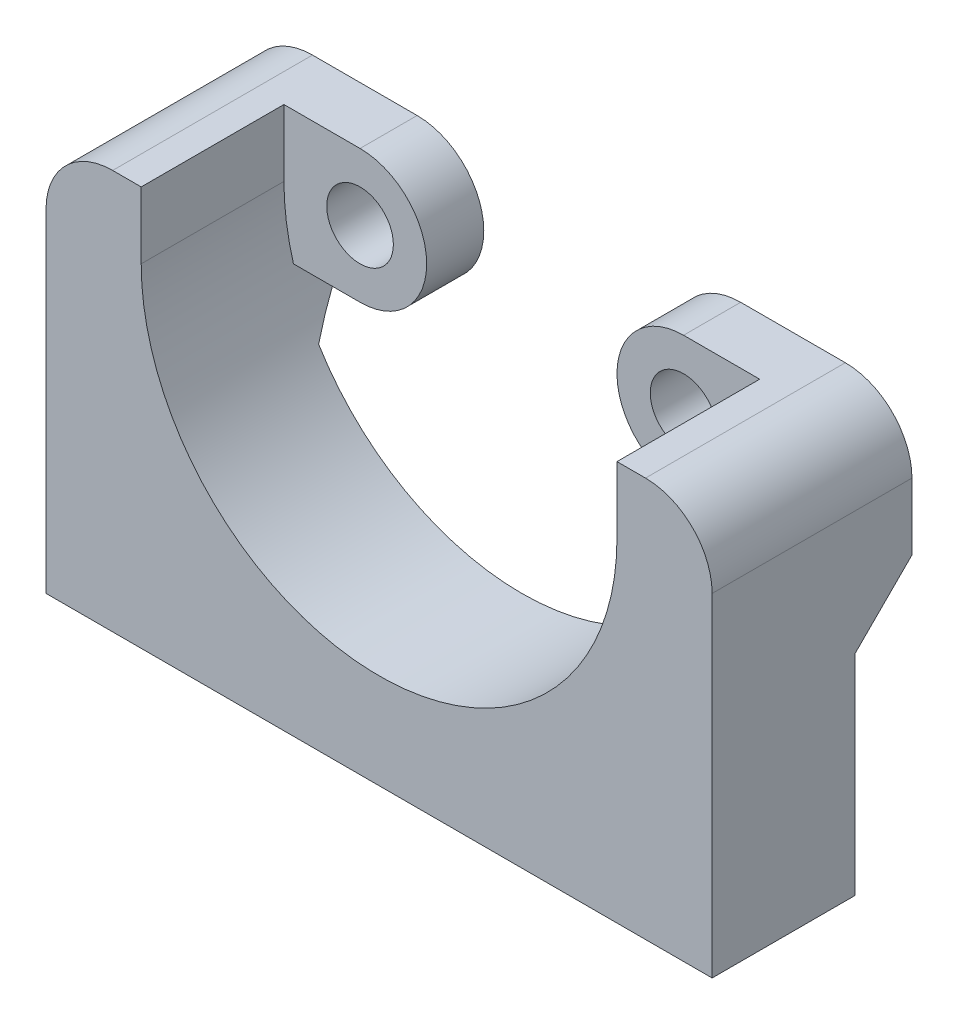
ISO-10303-21;
HEADER;
FILE_DESCRIPTION(('STEP AP214'),'2;1');
FILE_NAME('part.step','',(''),(''),'','','');
FILE_SCHEMA(('AUTOMOTIVE_DESIGN { 1 0 10303 214 1 1 1 1 }'));
ENDSEC;
DATA;
#1=APPLICATION_CONTEXT('core data for automotive mechanical design processes');
#2=APPLICATION_PROTOCOL_DEFINITION('international standard','automotive_design',2000,#1);
#3=PRODUCT_CONTEXT('',#1,'mechanical');
#4=PRODUCT('Part','Part','',(#3));
#5=PRODUCT_RELATED_PRODUCT_CATEGORY('part','',(#4));
#6=PRODUCT_DEFINITION_FORMATION('','',#4);
#7=PRODUCT_DEFINITION_CONTEXT('part definition',#1,'design');
#8=PRODUCT_DEFINITION('design','',#6,#7);
#9=PRODUCT_DEFINITION_SHAPE('','',#8);
#10=(LENGTH_UNIT() NAMED_UNIT(*) SI_UNIT(.MILLI.,.METRE.));
#11=(NAMED_UNIT(*) PLANE_ANGLE_UNIT() SI_UNIT($,.RADIAN.));
#12=(NAMED_UNIT(*) SI_UNIT($,.STERADIAN.) SOLID_ANGLE_UNIT());
#13=UNCERTAINTY_MEASURE_WITH_UNIT(LENGTH_MEASURE(1.E-05),#10,'distance_accuracy_value','');
#14=(GEOMETRIC_REPRESENTATION_CONTEXT(3) GLOBAL_UNCERTAINTY_ASSIGNED_CONTEXT((#13)) GLOBAL_UNIT_ASSIGNED_CONTEXT((#10,
#11,#12)) REPRESENTATION_CONTEXT('',''));
#15=CARTESIAN_POINT('',(0.,0.,0.));
#16=DIRECTION('',(0.,0.,1.));
#17=DIRECTION('',(1.,0.,0.));
#18=AXIS2_PLACEMENT_3D('',#15,#16,#17);
#19=CARTESIAN_POINT('',(8.5,17.5,0.));
#20=DIRECTION('',(0.,0.,-1.));
#21=DIRECTION('',(-1.,0.,0.));
#22=AXIS2_PLACEMENT_3D('',#19,#20,#21);
#23=PLANE('',#22);
#24=CARTESIAN_POINT('',(8.5,17.5,0.));
#25=DIRECTION('',(0.,0.,-1.));
#26=DIRECTION('',(-1.,0.,0.));
#27=AXIS2_PLACEMENT_3D('',#24,#25,#26);
#28=CIRCLE('',#27,1.75);
#29=CARTESIAN_POINT('',(6.75,17.5,0.));
#30=VERTEX_POINT('',#29);
#31=EDGE_CURVE('E280',#30,#30,#28,.T.);
#32=ORIENTED_EDGE('',*,*,#31,.T.);
#33=EDGE_LOOP('',(#32));
#34=FACE_BOUND('',#33,.T.);
#35=DIRECTION('',(-1.,0.,0.));
#36=VECTOR('',#35,1.);
#37=CARTESIAN_POINT('',(8.5,14.,0.));
#38=LINE('',#37,#36);
#39=CARTESIAN_POINT('',(12.,14.,0.));
#40=VERTEX_POINT('',#39);
#41=CARTESIAN_POINT('',(8.5,14.,0.));
#42=VERTEX_POINT('',#41);
#43=EDGE_CURVE('E213',#40,#42,#38,.T.);
#44=ORIENTED_EDGE('',*,*,#43,.F.);
#45=CARTESIAN_POINT('',(0.,17.5,0.));
#46=DIRECTION('',(0.,0.,-1.));
#47=DIRECTION('',(1.,0.,0.));
#48=AXIS2_PLACEMENT_3D('',#45,#46,#47);
#49=CIRCLE('',#48,12.5);
#50=CARTESIAN_POINT('',(12.5,17.5,0.));
#51=VERTEX_POINT('',#50);
#52=EDGE_CURVE('E189',#51,#40,#49,.T.);
#53=ORIENTED_EDGE('',*,*,#52,.F.);
#54=DIRECTION('',(0.,-1.,0.));
#55=VECTOR('',#54,1.);
#56=CARTESIAN_POINT('',(12.5,30.01387818866,0.));
#57=LINE('',#56,#55);
#58=CARTESIAN_POINT('',(12.5,21.,0.));
#59=VERTEX_POINT('',#58);
#60=EDGE_CURVE('E318',#59,#51,#57,.T.);
#61=ORIENTED_EDGE('',*,*,#60,.F.);
#62=DIRECTION('',(1.,0.,0.));
#63=VECTOR('',#62,1.);
#64=CARTESIAN_POINT('',(8.5,21.,0.));
#65=LINE('',#64,#63);
#66=CARTESIAN_POINT('',(8.5,21.,0.));
#67=VERTEX_POINT('',#66);
#68=EDGE_CURVE('E210',#67,#59,#65,.T.);
#69=ORIENTED_EDGE('',*,*,#68,.F.);
#70=CARTESIAN_POINT('',(8.5,17.5,0.));
#71=DIRECTION('',(0.,0.,-1.));
#72=DIRECTION('',(-1.,0.,0.));
#73=AXIS2_PLACEMENT_3D('',#70,#71,#72);
#74=CIRCLE('',#73,3.5);
#75=EDGE_CURVE('E207',#42,#67,#74,.T.);
#76=ORIENTED_EDGE('',*,*,#75,.F.);
#77=EDGE_LOOP('',(#44,#53,#61,#69,#76));
#78=FACE_BOUND('',#77,.T.);
#79=ADVANCED_FACE('F37',(#34,#78),#23,.F.);
#80=CARTESIAN_POINT('',(17.5,14.,-3.));
#81=DIRECTION('',(0.,0.707106781186548,0.707106781186547));
#82=DIRECTION('',(0.,-0.707106781186547,0.707106781186548));
#83=AXIS2_PLACEMENT_3D('',#80,#81,#82);
#84=PLANE('',#83);
#85=DIRECTION('',(-1.,0.,0.));
#86=VECTOR('',#85,1.);
#87=CARTESIAN_POINT('',(0.,11.,0.));
#88=LINE('',#87,#86);
#89=CARTESIAN_POINT('',(10.6770782520313,11.,0.));
#90=VERTEX_POINT('',#89);
#91=CARTESIAN_POINT('',(17.5,11.,0.));
#92=VERTEX_POINT('',#91);
#93=EDGE_CURVE('E59',#90,#92,#88,.F.);
#94=ORIENTED_EDGE('',*,*,#93,.F.);
#95=CARTESIAN_POINT('',(-4.42354486374086E-12,17.500000000002,-6.50000000000196));
#96=DIRECTION('',(0.,0.707106781186548,0.707106781186547));
#97=DIRECTION('',(0.,-0.707106781186547,0.707106781186548));
#98=AXIS2_PLACEMENT_3D('',#95,#96,#97);
#99=ELLIPSE('',#98,17.6776695296705,12.5000000000048);
#100=CARTESIAN_POINT('',(12.,14.,-3.));
#101=VERTEX_POINT('',#100);
#102=EDGE_CURVE('E11',#90,#101,#99,.T.);
#103=ORIENTED_EDGE('',*,*,#102,.T.);
#104=DIRECTION('',(-1.,0.,0.));
#105=VECTOR('',#104,1.);
#106=CARTESIAN_POINT('',(8.5,14.,-3.));
#107=LINE('',#106,#105);
#108=CARTESIAN_POINT('',(17.5,14.,-3.));
#109=VERTEX_POINT('',#108);
#110=EDGE_CURVE('E181',#109,#101,#107,.T.);
#111=ORIENTED_EDGE('',*,*,#110,.F.);
#112=DIRECTION('',(0.,-0.707106781186547,0.707106781186548));
#113=VECTOR('',#112,1.);
#114=CARTESIAN_POINT('',(17.5,14.,-3.));
#115=LINE('',#114,#113);
#116=EDGE_CURVE('E303',#109,#92,#115,.T.);
#117=ORIENTED_EDGE('',*,*,#116,.T.);
#118=EDGE_LOOP('',(#94,#103,#111,#117));
#119=FACE_BOUND('',#118,.T.);
#120=ADVANCED_FACE('F194',(#119),#84,.F.);
#121=CARTESIAN_POINT('',(0.,17.5,0.));
#122=DIRECTION('',(0.,0.,1.));
#123=DIRECTION('',(1.,0.,0.));
#124=AXIS2_PLACEMENT_3D('',#121,#122,#123);
#125=PLANE('',#124);
#126=CARTESIAN_POINT('',(-10.6770782520313,11.,0.));
#127=VERTEX_POINT('',#126);
#128=EDGE_CURVE('E234',#90,#127,#49,.T.);
#129=ORIENTED_EDGE('',*,*,#128,.F.);
#130=ORIENTED_EDGE('',*,*,#93,.T.);
#131=DIRECTION('',(0.,1.,0.));
#132=VECTOR('',#131,1.);
#133=CARTESIAN_POINT('',(17.5,0.,0.));
#134=LINE('',#133,#132);
#135=CARTESIAN_POINT('',(17.5,0.,0.));
#136=VERTEX_POINT('',#135);
#137=EDGE_CURVE('E220',#136,#92,#134,.T.);
#138=ORIENTED_EDGE('',*,*,#137,.F.);
#139=DIRECTION('',(1.,0.,0.));
#140=VECTOR('',#139,1.);
#141=CARTESIAN_POINT('',(-17.5,0.,0.));
#142=LINE('',#141,#140);
#143=CARTESIAN_POINT('',(-17.5,0.,0.));
#144=VERTEX_POINT('',#143);
#145=EDGE_CURVE('E224',#144,#136,#142,.T.);
#146=ORIENTED_EDGE('',*,*,#145,.F.);
#147=DIRECTION('',(0.,-1.,0.));
#148=VECTOR('',#147,1.);
#149=CARTESIAN_POINT('',(-17.5,0.,0.));
#150=LINE('',#149,#148);
#151=CARTESIAN_POINT('',(-17.5,11.,0.));
#152=VERTEX_POINT('',#151);
#153=EDGE_CURVE('E52',#152,#144,#150,.T.);
#154=ORIENTED_EDGE('',*,*,#153,.F.);
#155=DIRECTION('',(1.,0.,0.));
#156=VECTOR('',#155,1.);
#157=CARTESIAN_POINT('',(0.,11.,0.));
#158=LINE('',#157,#156);
#159=EDGE_CURVE('E392',#152,#127,#158,.T.);
#160=ORIENTED_EDGE('',*,*,#159,.T.);
#161=EDGE_LOOP('',(#129,#130,#138,#146,#154,#160));
#162=FACE_BOUND('',#161,.T.);
#163=ADVANCED_FACE('F386',(#162),#125,.F.);
#164=CARTESIAN_POINT('',(-8.5,14.,-3.));
#165=DIRECTION('',(0.,1.,0.));
#166=DIRECTION('',(-1.,0.,0.));
#167=AXIS2_PLACEMENT_3D('',#164,#165,#166);
#168=PLANE('',#167);
#169=DIRECTION('',(-1.,0.,0.));
#170=VECTOR('',#169,1.);
#171=CARTESIAN_POINT('',(-8.5,14.,0.));
#172=LINE('',#171,#170);
#173=CARTESIAN_POINT('',(-8.5,14.,0.));
#174=VERTEX_POINT('',#173);
#175=CARTESIAN_POINT('',(-12.,14.,0.));
#176=VERTEX_POINT('',#175);
#177=EDGE_CURVE('E258',#174,#176,#172,.T.);
#178=ORIENTED_EDGE('',*,*,#177,.T.);
#179=DIRECTION('',(0.,0.,1.));
#180=VECTOR('',#179,1.);
#181=CARTESIAN_POINT('',(-12.,14.,-3.));
#182=LINE('',#181,#180);
#183=CARTESIAN_POINT('',(-12.,14.,-3.));
#184=VERTEX_POINT('',#183);
#185=EDGE_CURVE('E190',#184,#176,#182,.T.);
#186=ORIENTED_EDGE('',*,*,#185,.F.);
#187=DIRECTION('',(-1.,0.,0.));
#188=VECTOR('',#187,1.);
#189=CARTESIAN_POINT('',(-8.5,14.,-3.));
#190=LINE('',#189,#188);
#191=CARTESIAN_POINT('',(-8.5,14.,-3.));
#192=VERTEX_POINT('',#191);
#193=EDGE_CURVE('E256',#192,#184,#190,.T.);
#194=ORIENTED_EDGE('',*,*,#193,.F.);
#195=DIRECTION('',(0.,0.,1.));
#196=VECTOR('',#195,1.);
#197=CARTESIAN_POINT('',(-8.5,14.,-3.));
#198=LINE('',#197,#196);
#199=EDGE_CURVE('E332',#192,#174,#198,.T.);
#200=ORIENTED_EDGE('',*,*,#199,.T.);
#201=EDGE_LOOP('',(#178,#186,#194,#200));
#202=FACE_BOUND('',#201,.T.);
#203=ADVANCED_FACE('F254',(#202),#168,.F.);
#204=CARTESIAN_POINT('',(8.5,14.,-3.));
#205=DIRECTION('',(0.,1.,0.));
#206=DIRECTION('',(-1.,0.,0.));
#207=AXIS2_PLACEMENT_3D('',#204,#205,#206);
#208=PLANE('',#207);
#209=CARTESIAN_POINT('',(8.5,14.,-3.));
#210=VERTEX_POINT('',#209);
#211=EDGE_CURVE('E170',#101,#210,#107,.T.);
#212=ORIENTED_EDGE('',*,*,#211,.F.);
#213=DIRECTION('',(0.,0.,1.));
#214=VECTOR('',#213,1.);
#215=CARTESIAN_POINT('',(12.,14.,-3.));
#216=LINE('',#215,#214);
#217=EDGE_CURVE('E173',#101,#40,#216,.T.);
#218=ORIENTED_EDGE('',*,*,#217,.T.);
#219=ORIENTED_EDGE('',*,*,#43,.T.);
#220=DIRECTION('',(0.,0.,1.));
#221=VECTOR('',#220,1.);
#222=CARTESIAN_POINT('',(8.5,14.,-3.));
#223=LINE('',#222,#221);
#224=EDGE_CURVE('E176',#210,#42,#223,.T.);
#225=ORIENTED_EDGE('',*,*,#224,.F.);
#226=EDGE_LOOP('',(#212,#218,#219,#225));
#227=FACE_BOUND('',#226,.T.);
#228=ADVANCED_FACE('F172',(#227),#208,.F.);
#229=CARTESIAN_POINT('',(14.,17.5,-3.));
#230=DIRECTION('',(0.,0.,1.));
#231=DIRECTION('',(1.,0.,0.));
#232=AXIS2_PLACEMENT_3D('',#229,#230,#231);
#233=CYLINDRICAL_SURFACE('',#232,3.5);
#234=DIRECTION('',(0.,0.,-1.));
#235=VECTOR('',#234,1.);
#236=CARTESIAN_POINT('',(17.5,17.5,7.5));
#237=LINE('',#236,#235);
#238=CARTESIAN_POINT('',(17.5,17.5,7.5));
#239=VERTEX_POINT('',#238);
#240=CARTESIAN_POINT('',(17.5,17.5,-3.));
#241=VERTEX_POINT('',#240);
#242=EDGE_CURVE('E297',#239,#241,#237,.T.);
#243=ORIENTED_EDGE('',*,*,#242,.T.);
#244=CARTESIAN_POINT('',(14.,17.5,-3.));
#245=DIRECTION('',(0.,0.,-1.));
#246=DIRECTION('',(-1.,0.,0.));
#247=AXIS2_PLACEMENT_3D('',#244,#245,#246);
#248=CIRCLE('',#247,3.5);
#249=CARTESIAN_POINT('',(14.,21.,-3.));
#250=VERTEX_POINT('',#249);
#251=EDGE_CURVE('E182',#250,#241,#248,.T.);
#252=ORIENTED_EDGE('',*,*,#251,.F.);
#253=DIRECTION('',(0.,0.,1.));
#254=VECTOR('',#253,1.);
#255=CARTESIAN_POINT('',(14.,21.,-3.));
#256=LINE('',#255,#254);
#257=CARTESIAN_POINT('',(14.,21.,7.5));
#258=VERTEX_POINT('',#257);
#259=EDGE_CURVE('E202',#250,#258,#256,.T.);
#260=ORIENTED_EDGE('',*,*,#259,.T.);
#261=CARTESIAN_POINT('',(14.,17.5,7.5));
#262=DIRECTION('',(0.,0.,-1.));
#263=DIRECTION('',(1.,0.,0.));
#264=AXIS2_PLACEMENT_3D('',#261,#262,#263);
#265=CIRCLE('',#264,3.5);
#266=EDGE_CURVE('E298',#258,#239,#265,.T.);
#267=ORIENTED_EDGE('',*,*,#266,.T.);
#268=EDGE_LOOP('',(#243,#252,#260,#267));
#269=FACE_BOUND('',#268,.T.);
#270=ADVANCED_FACE('F293',(#269),#233,.T.);
#271=CARTESIAN_POINT('',(0.,17.5,7.5));
#272=DIRECTION('',(0.,0.,1.));
#273=DIRECTION('',(1.,0.,0.));
#274=AXIS2_PLACEMENT_3D('',#271,#272,#273);
#275=PLANE('',#274);
#276=DIRECTION('',(0.,-1.,0.));
#277=VECTOR('',#276,1.);
#278=CARTESIAN_POINT('',(-17.5,0.,7.5));
#279=LINE('',#278,#277);
#280=CARTESIAN_POINT('',(-17.5,17.5,7.5));
#281=VERTEX_POINT('',#280);
#282=CARTESIAN_POINT('',(-17.5,0.,7.5));
#283=VERTEX_POINT('',#282);
#284=EDGE_CURVE('E226',#281,#283,#279,.T.);
#285=ORIENTED_EDGE('',*,*,#284,.T.);
#286=DIRECTION('',(1.,0.,0.));
#287=VECTOR('',#286,1.);
#288=CARTESIAN_POINT('',(-17.5,0.,7.5));
#289=LINE('',#288,#287);
#290=CARTESIAN_POINT('',(17.5,0.,7.5));
#291=VERTEX_POINT('',#290);
#292=EDGE_CURVE('E228',#283,#291,#289,.T.);
#293=ORIENTED_EDGE('',*,*,#292,.T.);
#294=DIRECTION('',(0.,1.,0.));
#295=VECTOR('',#294,1.);
#296=CARTESIAN_POINT('',(17.5,0.,7.5));
#297=LINE('',#296,#295);
#298=EDGE_CURVE('E221',#291,#239,#297,.T.);
#299=ORIENTED_EDGE('',*,*,#298,.T.);
#300=ORIENTED_EDGE('',*,*,#266,.F.);
#301=DIRECTION('',(-1.,0.,0.));
#302=VECTOR('',#301,1.);
#303=CARTESIAN_POINT('',(17.5,21.,7.5));
#304=LINE('',#303,#302);
#305=CARTESIAN_POINT('',(12.5,21.,7.5));
#306=VERTEX_POINT('',#305);
#307=EDGE_CURVE('E316',#258,#306,#304,.T.);
#308=ORIENTED_EDGE('',*,*,#307,.T.);
#309=DIRECTION('',(0.,-1.,0.));
#310=VECTOR('',#309,1.);
#311=CARTESIAN_POINT('',(12.5,30.01387818866,7.5));
#312=LINE('',#311,#310);
#313=CARTESIAN_POINT('',(12.5,17.5,7.5));
#314=VERTEX_POINT('',#313);
#315=EDGE_CURVE('E320',#306,#314,#312,.T.);
#316=ORIENTED_EDGE('',*,*,#315,.T.);
#317=CARTESIAN_POINT('',(0.,17.5,7.5));
#318=DIRECTION('',(0.,0.,-1.));
#319=DIRECTION('',(1.,0.,0.));
#320=AXIS2_PLACEMENT_3D('',#317,#318,#319);
#321=CIRCLE('',#320,12.5);
#322=CARTESIAN_POINT('',(-12.5,17.5,7.5));
#323=VERTEX_POINT('',#322);
#324=EDGE_CURVE('E223',#314,#323,#321,.T.);
#325=ORIENTED_EDGE('',*,*,#324,.T.);
#326=DIRECTION('',(0.,-1.,0.));
#327=VECTOR('',#326,1.);
#328=CARTESIAN_POINT('',(-12.5,30.01387818866,7.5));
#329=LINE('',#328,#327);
#330=CARTESIAN_POINT('',(-12.5,21.,7.5));
#331=VERTEX_POINT('',#330);
#332=EDGE_CURVE('E329',#331,#323,#329,.T.);
#333=ORIENTED_EDGE('',*,*,#332,.F.);
#334=DIRECTION('',(-1.,0.,0.));
#335=VECTOR('',#334,1.);
#336=CARTESIAN_POINT('',(-17.5,21.,7.5));
#337=LINE('',#336,#335);
#338=CARTESIAN_POINT('',(-14.,21.,7.5));
#339=VERTEX_POINT('',#338);
#340=EDGE_CURVE('E328',#331,#339,#337,.T.);
#341=ORIENTED_EDGE('',*,*,#340,.T.);
#342=CARTESIAN_POINT('',(-14.,17.5,7.5));
#343=DIRECTION('',(0.,0.,1.));
#344=DIRECTION('',(-1.,0.,0.));
#345=AXIS2_PLACEMENT_3D('',#342,#343,#344);
#346=CIRCLE('',#345,3.5);
#347=EDGE_CURVE('E310',#339,#281,#346,.T.);
#348=ORIENTED_EDGE('',*,*,#347,.T.);
#349=EDGE_LOOP('',(#285,#293,#299,#300,#308,#316,#325,#333,#341,#348));
#350=FACE_BOUND('',#349,.T.);
#351=ADVANCED_FACE('F369',(#350),#275,.T.);
#352=CARTESIAN_POINT('',(17.5,0.,7.5));
#353=DIRECTION('',(-1.,0.,0.));
#354=DIRECTION('',(0.,0.,1.));
#355=AXIS2_PLACEMENT_3D('',#352,#353,#354);
#356=PLANE('',#355);
#357=ORIENTED_EDGE('',*,*,#137,.T.);
#358=ORIENTED_EDGE('',*,*,#116,.F.);
#359=DIRECTION('',(0.,-1.,0.));
#360=VECTOR('',#359,1.);
#361=CARTESIAN_POINT('',(17.5,14.,-3.));
#362=LINE('',#361,#360);
#363=EDGE_CURVE('E201',#241,#109,#362,.T.);
#364=ORIENTED_EDGE('',*,*,#363,.F.);
#365=ORIENTED_EDGE('',*,*,#242,.F.);
#366=ORIENTED_EDGE('',*,*,#298,.F.);
#367=DIRECTION('',(0.,0.,-1.));
#368=VECTOR('',#367,1.);
#369=CARTESIAN_POINT('',(17.5,0.,7.5));
#370=LINE('',#369,#368);
#371=EDGE_CURVE('E230',#291,#136,#370,.T.);
#372=ORIENTED_EDGE('',*,*,#371,.T.);
#373=EDGE_LOOP('',(#357,#358,#364,#365,#366,#372));
#374=FACE_BOUND('',#373,.T.);
#375=ADVANCED_FACE('F39',(#374),#356,.F.);
#376=CARTESIAN_POINT('',(-17.5,0.,7.5));
#377=DIRECTION('',(1.,0.,0.));
#378=DIRECTION('',(0.,0.,-1.));
#379=AXIS2_PLACEMENT_3D('',#376,#377,#378);
#380=PLANE('',#379);
#381=DIRECTION('',(0.,-0.707106781186547,0.707106781186548));
#382=VECTOR('',#381,1.);
#383=CARTESIAN_POINT('',(-17.5,14.,-3.));
#384=LINE('',#383,#382);
#385=CARTESIAN_POINT('',(-17.5,14.,-3.));
#386=VERTEX_POINT('',#385);
#387=EDGE_CURVE('E259',#386,#152,#384,.T.);
#388=ORIENTED_EDGE('',*,*,#387,.T.);
#389=ORIENTED_EDGE('',*,*,#153,.T.);
#390=DIRECTION('',(0.,0.,-1.));
#391=VECTOR('',#390,1.);
#392=CARTESIAN_POINT('',(-17.5,0.,7.5));
#393=LINE('',#392,#391);
#394=EDGE_CURVE('E239',#283,#144,#393,.T.);
#395=ORIENTED_EDGE('',*,*,#394,.F.);
#396=ORIENTED_EDGE('',*,*,#284,.F.);
#397=DIRECTION('',(0.,0.,-1.));
#398=VECTOR('',#397,1.);
#399=CARTESIAN_POINT('',(-17.5,17.5,7.5));
#400=LINE('',#399,#398);
#401=CARTESIAN_POINT('',(-17.5,17.5,-3.));
#402=VERTEX_POINT('',#401);
#403=EDGE_CURVE('E313',#281,#402,#400,.T.);
#404=ORIENTED_EDGE('',*,*,#403,.T.);
#405=DIRECTION('',(0.,-1.,0.));
#406=VECTOR('',#405,1.);
#407=CARTESIAN_POINT('',(-17.5,14.,-3.));
#408=LINE('',#407,#406);
#409=EDGE_CURVE('E301',#402,#386,#408,.T.);
#410=ORIENTED_EDGE('',*,*,#409,.T.);
#411=EDGE_LOOP('',(#388,#389,#395,#396,#404,#410));
#412=FACE_BOUND('',#411,.T.);
#413=ADVANCED_FACE('F391',(#412),#380,.F.);
#414=CARTESIAN_POINT('',(-8.5,17.5,0.));
#415=DIRECTION('',(0.,0.,1.));
#416=DIRECTION('',(1.,0.,0.));
#417=AXIS2_PLACEMENT_3D('',#414,#415,#416);
#418=PLANE('',#417);
#419=CARTESIAN_POINT('',(-12.5,17.5,0.));
#420=VERTEX_POINT('',#419);
#421=EDGE_CURVE('E232',#176,#420,#49,.T.);
#422=ORIENTED_EDGE('',*,*,#421,.F.);
#423=ORIENTED_EDGE('',*,*,#177,.F.);
#424=CARTESIAN_POINT('',(-8.5,17.5,0.));
#425=DIRECTION('',(0.,0.,-1.));
#426=DIRECTION('',(1.,0.,0.));
#427=AXIS2_PLACEMENT_3D('',#424,#425,#426);
#428=CIRCLE('',#427,3.5);
#429=CARTESIAN_POINT('',(-8.5,21.,0.));
#430=VERTEX_POINT('',#429);
#431=EDGE_CURVE('E284',#430,#174,#428,.T.);
#432=ORIENTED_EDGE('',*,*,#431,.F.);
#433=DIRECTION('',(1.,0.,0.));
#434=VECTOR('',#433,1.);
#435=CARTESIAN_POINT('',(-8.5,21.,0.));
#436=LINE('',#435,#434);
#437=CARTESIAN_POINT('',(-12.5,21.,0.));
#438=VERTEX_POINT('',#437);
#439=EDGE_CURVE('E276',#438,#430,#436,.T.);
#440=ORIENTED_EDGE('',*,*,#439,.F.);
#441=DIRECTION('',(0.,-1.,0.));
#442=VECTOR('',#441,1.);
#443=CARTESIAN_POINT('',(-12.5,30.01387818866,0.));
#444=LINE('',#443,#442);
#445=EDGE_CURVE('E322',#438,#420,#444,.T.);
#446=ORIENTED_EDGE('',*,*,#445,.T.);
#447=EDGE_LOOP('',(#422,#423,#432,#440,#446));
#448=FACE_BOUND('',#447,.T.);
#449=CARTESIAN_POINT('',(-8.5,17.5,0.));
#450=DIRECTION('',(0.,0.,-1.));
#451=DIRECTION('',(1.,0.,0.));
#452=AXIS2_PLACEMENT_3D('',#449,#450,#451);
#453=CIRCLE('',#452,1.75);
#454=CARTESIAN_POINT('',(-6.75,17.5,0.));
#455=VERTEX_POINT('',#454);
#456=EDGE_CURVE('E277',#455,#455,#453,.T.);
#457=ORIENTED_EDGE('',*,*,#456,.T.);
#458=EDGE_LOOP('',(#457));
#459=FACE_BOUND('',#458,.T.);
#460=ADVANCED_FACE('F362',(#448,#459),#418,.T.);
#461=CARTESIAN_POINT('',(0.,17.5,7.5));
#462=DIRECTION('',(0.,0.,-1.));
#463=DIRECTION('',(-1.,0.,0.));
#464=AXIS2_PLACEMENT_3D('',#461,#462,#463);
#465=CYLINDRICAL_SURFACE('',#464,12.5);
#466=DIRECTION('',(0.,0.,-1.));
#467=VECTOR('',#466,1.);
#468=CARTESIAN_POINT('',(-12.5,17.5,7.5));
#469=LINE('',#468,#467);
#470=EDGE_CURVE('E242',#323,#420,#469,.T.);
#471=ORIENTED_EDGE('',*,*,#470,.F.);
#472=ORIENTED_EDGE('',*,*,#324,.F.);
#473=DIRECTION('',(0.,0.,-1.));
#474=VECTOR('',#473,1.);
#475=CARTESIAN_POINT('',(12.5,17.5,7.5));
#476=LINE('',#475,#474);
#477=EDGE_CURVE('E245',#314,#51,#476,.T.);
#478=ORIENTED_EDGE('',*,*,#477,.T.);
#479=ORIENTED_EDGE('',*,*,#52,.T.);
#480=ORIENTED_EDGE('',*,*,#217,.F.);
#481=ORIENTED_EDGE('',*,*,#102,.F.);
#482=ORIENTED_EDGE('',*,*,#128,.T.);
#483=CARTESIAN_POINT('',(4.42354486374086E-12,17.500000000002,-6.50000000000196));
#484=DIRECTION('',(0.,-0.707106781186548,-0.707106781186547));
#485=DIRECTION('',(0.,-0.707106781186547,0.707106781186548));
#486=AXIS2_PLACEMENT_3D('',#483,#484,#485);
#487=ELLIPSE('',#486,17.6776695296705,12.5000000000048);
#488=EDGE_CURVE('E45',#127,#184,#487,.T.);
#489=ORIENTED_EDGE('',*,*,#488,.T.);
#490=ORIENTED_EDGE('',*,*,#185,.T.);
#491=ORIENTED_EDGE('',*,*,#421,.T.);
#492=EDGE_LOOP('',(#471,#472,#478,#479,#480,#481,#482,#489,#490,#491));
#493=FACE_BOUND('',#492,.T.);
#494=ADVANCED_FACE('F186',(#493),#465,.F.);
#495=CARTESIAN_POINT('',(-17.5,0.,7.5));
#496=DIRECTION('',(0.,1.,0.));
#497=DIRECTION('',(0.,0.,1.));
#498=AXIS2_PLACEMENT_3D('',#495,#496,#497);
#499=PLANE('',#498);
#500=ORIENTED_EDGE('',*,*,#145,.T.);
#501=ORIENTED_EDGE('',*,*,#371,.F.);
#502=ORIENTED_EDGE('',*,*,#292,.F.);
#503=ORIENTED_EDGE('',*,*,#394,.T.);
#504=EDGE_LOOP('',(#500,#501,#502,#503));
#505=FACE_BOUND('',#504,.T.);
#506=ADVANCED_FACE('F387',(#505),#499,.F.);
#507=CARTESIAN_POINT('',(8.5,17.5,-3.));
#508=DIRECTION('',(0.,0.,-1.));
#509=DIRECTION('',(-1.,0.,0.));
#510=AXIS2_PLACEMENT_3D('',#507,#508,#509);
#511=PLANE('',#510);
#512=ORIENTED_EDGE('',*,*,#110,.T.);
#513=ORIENTED_EDGE('',*,*,#211,.T.);
#514=CARTESIAN_POINT('',(8.5,17.5,-3.));
#515=DIRECTION('',(0.,0.,-1.));
#516=DIRECTION('',(-1.,0.,0.));
#517=AXIS2_PLACEMENT_3D('',#514,#515,#516);
#518=CIRCLE('',#517,3.5);
#519=CARTESIAN_POINT('',(8.5,21.,-3.));
#520=VERTEX_POINT('',#519);
#521=EDGE_CURVE('E214',#210,#520,#518,.T.);
#522=ORIENTED_EDGE('',*,*,#521,.T.);
#523=DIRECTION('',(1.,0.,0.));
#524=VECTOR('',#523,1.);
#525=CARTESIAN_POINT('',(8.5,21.,-3.));
#526=LINE('',#525,#524);
#527=EDGE_CURVE('E289',#520,#250,#526,.T.);
#528=ORIENTED_EDGE('',*,*,#527,.T.);
#529=ORIENTED_EDGE('',*,*,#251,.T.);
#530=ORIENTED_EDGE('',*,*,#363,.T.);
#531=EDGE_LOOP('',(#512,#513,#522,#528,#529,#530));
#532=FACE_BOUND('',#531,.T.);
#533=CARTESIAN_POINT('',(8.5,17.5,-3.));
#534=DIRECTION('',(0.,0.,-1.));
#535=DIRECTION('',(-1.,0.,0.));
#536=AXIS2_PLACEMENT_3D('',#533,#534,#535);
#537=CIRCLE('',#536,1.75);
#538=CARTESIAN_POINT('',(6.75,17.5,-3.));
#539=VERTEX_POINT('',#538);
#540=EDGE_CURVE('E211',#539,#539,#537,.T.);
#541=ORIENTED_EDGE('',*,*,#540,.F.);
#542=EDGE_LOOP('',(#541));
#543=FACE_BOUND('',#542,.T.);
#544=ADVANCED_FACE('F197',(#532,#543),#511,.T.);
#545=CARTESIAN_POINT('',(8.5,17.5,-3.));
#546=DIRECTION('',(0.,0.,1.));
#547=DIRECTION('',(1.,0.,0.));
#548=AXIS2_PLACEMENT_3D('',#545,#546,#547);
#549=CYLINDRICAL_SURFACE('',#548,3.5);
#550=ORIENTED_EDGE('',*,*,#75,.T.);
#551=DIRECTION('',(0.,0.,1.));
#552=VECTOR('',#551,1.);
#553=CARTESIAN_POINT('',(8.5,21.,-3.));
#554=LINE('',#553,#552);
#555=EDGE_CURVE('E217',#520,#67,#554,.T.);
#556=ORIENTED_EDGE('',*,*,#555,.F.);
#557=ORIENTED_EDGE('',*,*,#521,.F.);
#558=ORIENTED_EDGE('',*,*,#224,.T.);
#559=EDGE_LOOP('',(#550,#556,#557,#558));
#560=FACE_BOUND('',#559,.T.);
#561=ADVANCED_FACE('F377',(#560),#549,.T.);
#562=CARTESIAN_POINT('',(8.5,21.,-3.));
#563=DIRECTION('',(0.,-1.,0.));
#564=DIRECTION('',(1.,0.,0.));
#565=AXIS2_PLACEMENT_3D('',#562,#563,#564);
#566=PLANE('',#565);
#567=ORIENTED_EDGE('',*,*,#259,.F.);
#568=ORIENTED_EDGE('',*,*,#527,.F.);
#569=ORIENTED_EDGE('',*,*,#555,.T.);
#570=ORIENTED_EDGE('',*,*,#68,.T.);
#571=DIRECTION('',(0.,0.,-1.));
#572=VECTOR('',#571,1.);
#573=CARTESIAN_POINT('',(12.5,21.,0.));
#574=LINE('',#573,#572);
#575=EDGE_CURVE('E315',#306,#59,#574,.T.);
#576=ORIENTED_EDGE('',*,*,#575,.F.);
#577=ORIENTED_EDGE('',*,*,#307,.F.);
#578=EDGE_LOOP('',(#567,#568,#569,#570,#576,#577));
#579=FACE_BOUND('',#578,.T.);
#580=ADVANCED_FACE('F380',(#579),#566,.F.);
#581=CARTESIAN_POINT('',(8.5,17.5,-3.));
#582=DIRECTION('',(0.,0.,1.));
#583=DIRECTION('',(1.,0.,0.));
#584=AXIS2_PLACEMENT_3D('',#581,#582,#583);
#585=CYLINDRICAL_SURFACE('',#584,1.75);
#586=ORIENTED_EDGE('',*,*,#540,.T.);
#587=EDGE_LOOP('',(#586));
#588=FACE_BOUND('',#587,.T.);
#589=ORIENTED_EDGE('',*,*,#31,.F.);
#590=EDGE_LOOP('',(#589));
#591=FACE_BOUND('',#590,.T.);
#592=ADVANCED_FACE('F424',(#588,#591),#585,.F.);
#593=CARTESIAN_POINT('',(-8.5,17.5,-3.));
#594=DIRECTION('',(0.,0.,1.));
#595=DIRECTION('',(1.,0.,0.));
#596=AXIS2_PLACEMENT_3D('',#593,#594,#595);
#597=PLANE('',#596);
#598=DIRECTION('',(1.,0.,0.));
#599=VECTOR('',#598,1.);
#600=CARTESIAN_POINT('',(-8.5,21.,-3.));
#601=LINE('',#600,#599);
#602=CARTESIAN_POINT('',(-14.,21.,-3.));
#603=VERTEX_POINT('',#602);
#604=CARTESIAN_POINT('',(-8.5,21.,-3.));
#605=VERTEX_POINT('',#604);
#606=EDGE_CURVE('E271',#603,#605,#601,.T.);
#607=ORIENTED_EDGE('',*,*,#606,.T.);
#608=CARTESIAN_POINT('',(-8.5,17.5,-3.));
#609=DIRECTION('',(0.,0.,-1.));
#610=DIRECTION('',(1.,0.,0.));
#611=AXIS2_PLACEMENT_3D('',#608,#609,#610);
#612=CIRCLE('',#611,3.5);
#613=EDGE_CURVE('E270',#605,#192,#612,.T.);
#614=ORIENTED_EDGE('',*,*,#613,.T.);
#615=ORIENTED_EDGE('',*,*,#193,.T.);
#616=EDGE_CURVE('E262',#184,#386,#190,.T.);
#617=ORIENTED_EDGE('',*,*,#616,.T.);
#618=ORIENTED_EDGE('',*,*,#409,.F.);
#619=CARTESIAN_POINT('',(-14.,17.5,-3.));
#620=DIRECTION('',(0.,0.,-1.));
#621=DIRECTION('',(1.,0.,0.));
#622=AXIS2_PLACEMENT_3D('',#619,#620,#621);
#623=CIRCLE('',#622,3.5);
#624=EDGE_CURVE('E268',#402,#603,#623,.T.);
#625=ORIENTED_EDGE('',*,*,#624,.T.);
#626=EDGE_LOOP('',(#607,#614,#615,#617,#618,#625));
#627=FACE_BOUND('',#626,.T.);
#628=CARTESIAN_POINT('',(-8.5,17.5,-3.));
#629=DIRECTION('',(0.,0.,-1.));
#630=DIRECTION('',(1.,0.,0.));
#631=AXIS2_PLACEMENT_3D('',#628,#629,#630);
#632=CIRCLE('',#631,1.75);
#633=CARTESIAN_POINT('',(-6.75,17.5,-3.));
#634=VERTEX_POINT('',#633);
#635=EDGE_CURVE('E281',#634,#634,#632,.T.);
#636=ORIENTED_EDGE('',*,*,#635,.F.);
#637=EDGE_LOOP('',(#636));
#638=FACE_BOUND('',#637,.T.);
#639=ADVANCED_FACE('F348',(#627,#638),#597,.F.);
#640=CARTESIAN_POINT('',(-8.5,17.5,-3.));
#641=DIRECTION('',(0.,0.,1.));
#642=DIRECTION('',(1.,0.,0.));
#643=AXIS2_PLACEMENT_3D('',#640,#641,#642);
#644=CYLINDRICAL_SURFACE('',#643,3.5);
#645=ORIENTED_EDGE('',*,*,#431,.T.);
#646=ORIENTED_EDGE('',*,*,#199,.F.);
#647=ORIENTED_EDGE('',*,*,#613,.F.);
#648=DIRECTION('',(0.,0.,1.));
#649=VECTOR('',#648,1.);
#650=CARTESIAN_POINT('',(-8.5,21.,-3.));
#651=LINE('',#650,#649);
#652=EDGE_CURVE('E340',#605,#430,#651,.T.);
#653=ORIENTED_EDGE('',*,*,#652,.T.);
#654=EDGE_LOOP('',(#645,#646,#647,#653));
#655=FACE_BOUND('',#654,.T.);
#656=ADVANCED_FACE('F360',(#655),#644,.T.);
#657=CARTESIAN_POINT('',(-14.,17.5,-3.));
#658=DIRECTION('',(0.,0.,1.));
#659=DIRECTION('',(1.,0.,0.));
#660=AXIS2_PLACEMENT_3D('',#657,#658,#659);
#661=CYLINDRICAL_SURFACE('',#660,3.5);
#662=ORIENTED_EDGE('',*,*,#624,.F.);
#663=ORIENTED_EDGE('',*,*,#403,.F.);
#664=ORIENTED_EDGE('',*,*,#347,.F.);
#665=DIRECTION('',(0.,0.,1.));
#666=VECTOR('',#665,1.);
#667=CARTESIAN_POINT('',(-14.,21.,-3.));
#668=LINE('',#667,#666);
#669=EDGE_CURVE('E338',#603,#339,#668,.T.);
#670=ORIENTED_EDGE('',*,*,#669,.F.);
#671=EDGE_LOOP('',(#662,#663,#664,#670));
#672=FACE_BOUND('',#671,.T.);
#673=ADVANCED_FACE('F396',(#672),#661,.T.);
#674=CARTESIAN_POINT('',(-8.5,21.,-3.));
#675=DIRECTION('',(0.,-1.,0.));
#676=DIRECTION('',(1.,0.,0.));
#677=AXIS2_PLACEMENT_3D('',#674,#675,#676);
#678=PLANE('',#677);
#679=ORIENTED_EDGE('',*,*,#439,.T.);
#680=ORIENTED_EDGE('',*,*,#652,.F.);
#681=ORIENTED_EDGE('',*,*,#606,.F.);
#682=ORIENTED_EDGE('',*,*,#669,.T.);
#683=ORIENTED_EDGE('',*,*,#340,.F.);
#684=DIRECTION('',(0.,0.,1.));
#685=VECTOR('',#684,1.);
#686=CARTESIAN_POINT('',(-12.5,21.,0.));
#687=LINE('',#686,#685);
#688=EDGE_CURVE('E325',#438,#331,#687,.T.);
#689=ORIENTED_EDGE('',*,*,#688,.F.);
#690=EDGE_LOOP('',(#679,#680,#681,#682,#683,#689));
#691=FACE_BOUND('',#690,.T.);
#692=ADVANCED_FACE('F355',(#691),#678,.F.);
#693=CARTESIAN_POINT('',(-8.5,17.5,-3.));
#694=DIRECTION('',(0.,0.,1.));
#695=DIRECTION('',(1.,0.,0.));
#696=AXIS2_PLACEMENT_3D('',#693,#694,#695);
#697=CYLINDRICAL_SURFACE('',#696,1.75);
#698=ORIENTED_EDGE('',*,*,#635,.T.);
#699=EDGE_LOOP('',(#698));
#700=FACE_BOUND('',#699,.T.);
#701=ORIENTED_EDGE('',*,*,#456,.F.);
#702=EDGE_LOOP('',(#701));
#703=FACE_BOUND('',#702,.T.);
#704=ADVANCED_FACE('F404',(#700,#703),#697,.F.);
#705=CARTESIAN_POINT('',(-12.5,30.01387818866,0.));
#706=DIRECTION('',(-1.,0.,0.));
#707=DIRECTION('',(0.,0.,1.));
#708=AXIS2_PLACEMENT_3D('',#705,#706,#707);
#709=PLANE('',#708);
#710=ORIENTED_EDGE('',*,*,#445,.F.);
#711=ORIENTED_EDGE('',*,*,#688,.T.);
#712=ORIENTED_EDGE('',*,*,#332,.T.);
#713=ORIENTED_EDGE('',*,*,#470,.T.);
#714=EDGE_LOOP('',(#710,#711,#712,#713));
#715=FACE_BOUND('',#714,.T.);
#716=ADVANCED_FACE('F366',(#715),#709,.F.);
#717=CARTESIAN_POINT('',(12.5,30.01387818866,0.));
#718=DIRECTION('',(1.,0.,0.));
#719=DIRECTION('',(0.,0.,-1.));
#720=AXIS2_PLACEMENT_3D('',#717,#718,#719);
#721=PLANE('',#720);
#722=ORIENTED_EDGE('',*,*,#315,.F.);
#723=ORIENTED_EDGE('',*,*,#575,.T.);
#724=ORIENTED_EDGE('',*,*,#60,.T.);
#725=ORIENTED_EDGE('',*,*,#477,.F.);
#726=EDGE_LOOP('',(#722,#723,#724,#725));
#727=FACE_BOUND('',#726,.T.);
#728=ADVANCED_FACE('F529',(#727),#721,.F.);
#729=CARTESIAN_POINT('',(-17.5,14.,-3.));
#730=DIRECTION('',(0.,-0.707106781186548,-0.707106781186547));
#731=DIRECTION('',(0.,-0.707106781186547,0.707106781186548));
#732=AXIS2_PLACEMENT_3D('',#729,#730,#731);
#733=PLANE('',#732);
#734=ORIENTED_EDGE('',*,*,#488,.F.);
#735=ORIENTED_EDGE('',*,*,#159,.F.);
#736=ORIENTED_EDGE('',*,*,#387,.F.);
#737=ORIENTED_EDGE('',*,*,#616,.F.);
#738=EDGE_LOOP('',(#734,#735,#736,#737));
#739=FACE_BOUND('',#738,.T.);
#740=ADVANCED_FACE('F263',(#739),#733,.T.);
#741=CLOSED_SHELL('',(#79,#120,#163,#203,#228,#270,#351,#375,#413,#460,#494,#506,#544,#561,#580,
#592,#639,#656,#673,#692,#704,#716,#728,#740));
#742=MANIFOLD_SOLID_BREP('B2',#741);
#743=ADVANCED_BREP_SHAPE_REPRESENTATION('',(#18,#742),#14);
#744=SHAPE_DEFINITION_REPRESENTATION(#9,#743);
ENDSEC;
END-ISO-10303-21;
